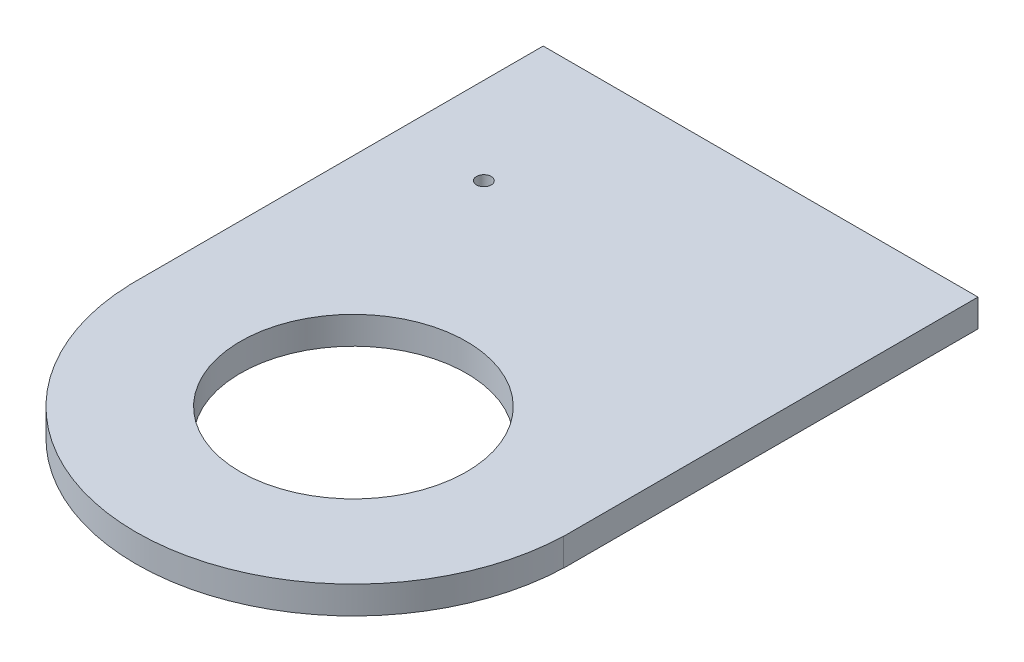
ISO-10303-21;
HEADER;
FILE_DESCRIPTION(('STEP AP214'),'2;1');
FILE_NAME('part.step','',(''),(''),'','','');
FILE_SCHEMA(('AUTOMOTIVE_DESIGN { 1 0 10303 214 1 1 1 1 }'));
ENDSEC;
DATA;
#1=APPLICATION_CONTEXT('core data for automotive mechanical design processes');
#2=APPLICATION_PROTOCOL_DEFINITION('international standard','automotive_design',2000,#1);
#3=PRODUCT_CONTEXT('',#1,'mechanical');
#4=PRODUCT('Part','Part','',(#3));
#5=PRODUCT_RELATED_PRODUCT_CATEGORY('part','',(#4));
#6=PRODUCT_DEFINITION_FORMATION('','',#4);
#7=PRODUCT_DEFINITION_CONTEXT('part definition',#1,'design');
#8=PRODUCT_DEFINITION('design','',#6,#7);
#9=PRODUCT_DEFINITION_SHAPE('','',#8);
#10=(LENGTH_UNIT() NAMED_UNIT(*) SI_UNIT(.MILLI.,.METRE.));
#11=(NAMED_UNIT(*) PLANE_ANGLE_UNIT() SI_UNIT($,.RADIAN.));
#12=(NAMED_UNIT(*) SI_UNIT($,.STERADIAN.) SOLID_ANGLE_UNIT());
#13=UNCERTAINTY_MEASURE_WITH_UNIT(LENGTH_MEASURE(1.E-05),#10,'distance_accuracy_value','');
#14=(GEOMETRIC_REPRESENTATION_CONTEXT(3) GLOBAL_UNCERTAINTY_ASSIGNED_CONTEXT((#13)) GLOBAL_UNIT_ASSIGNED_CONTEXT((#10,
#11,#12)) REPRESENTATION_CONTEXT('',''));
#15=CARTESIAN_POINT('',(0.,0.,0.));
#16=DIRECTION('',(0.,0.,1.));
#17=DIRECTION('',(1.,0.,0.));
#18=AXIS2_PLACEMENT_3D('',#15,#16,#17);
#19=CARTESIAN_POINT('',(-50.,36.1,171.65));
#20=DIRECTION('',(0.,0.,-1.));
#21=DIRECTION('',(-1.,0.,0.));
#22=AXIS2_PLACEMENT_3D('',#19,#20,#21);
#23=PLANE('',#22);
#24=DIRECTION('',(0.,-1.,0.));
#25=VECTOR('',#24,1.);
#26=CARTESIAN_POINT('',(49.9727675839552,36.1,171.65));
#27=LINE('',#26,#25);
#28=CARTESIAN_POINT('',(49.9727675839552,29.75,171.65));
#29=VERTEX_POINT('',#28);
#30=CARTESIAN_POINT('',(49.9727675839552,36.1,171.65));
#31=VERTEX_POINT('',#30);
#32=EDGE_CURVE('E116',#29,#31,#27,.F.);
#33=ORIENTED_EDGE('',*,*,#32,.F.);
#34=DIRECTION('',(1.,0.,0.));
#35=VECTOR('',#34,1.);
#36=CARTESIAN_POINT('',(-50.,29.75,171.65));
#37=LINE('',#36,#35);
#38=CARTESIAN_POINT('',(50.,29.75,171.65));
#39=VERTEX_POINT('',#38);
#40=EDGE_CURVE('E106',#29,#39,#37,.T.);
#41=ORIENTED_EDGE('',*,*,#40,.T.);
#42=DIRECTION('',(0.,-1.,0.));
#43=VECTOR('',#42,1.);
#44=CARTESIAN_POINT('',(50.,36.1,171.65));
#45=LINE('',#44,#43);
#46=CARTESIAN_POINT('',(50.,36.1,171.65));
#47=VERTEX_POINT('',#46);
#48=EDGE_CURVE('E147',#47,#39,#45,.T.);
#49=ORIENTED_EDGE('',*,*,#48,.F.);
#50=DIRECTION('',(1.,0.,0.));
#51=VECTOR('',#50,1.);
#52=CARTESIAN_POINT('',(-50.,36.1,171.65));
#53=LINE('',#52,#51);
#54=EDGE_CURVE('E56',#31,#47,#53,.T.);
#55=ORIENTED_EDGE('',*,*,#54,.F.);
#56=EDGE_LOOP('',(#33,#41,#49,#55));
#57=FACE_BOUND('',#56,.T.);
#58=ADVANCED_FACE('F43',(#57),#23,.F.);
#59=DIRECTION('',(0.,-1.,0.));
#60=VECTOR('',#59,1.);
#61=CARTESIAN_POINT('',(-49.9727675839552,36.1,171.65));
#62=LINE('',#61,#60);
#63=CARTESIAN_POINT('',(-49.9727675839552,36.1,171.65));
#64=VERTEX_POINT('',#63);
#65=CARTESIAN_POINT('',(-49.9727675839552,29.75,171.65));
#66=VERTEX_POINT('',#65);
#67=EDGE_CURVE('E70',#64,#66,#62,.T.);
#68=ORIENTED_EDGE('',*,*,#67,.F.);
#69=CARTESIAN_POINT('',(-50.,36.1,171.65));
#70=VERTEX_POINT('',#69);
#71=EDGE_CURVE('E143',#70,#64,#53,.T.);
#72=ORIENTED_EDGE('',*,*,#71,.F.);
#73=DIRECTION('',(0.,-1.,0.));
#74=VECTOR('',#73,1.);
#75=CARTESIAN_POINT('',(-50.,36.1,171.65));
#76=LINE('',#75,#74);
#77=CARTESIAN_POINT('',(-50.,29.75,171.65));
#78=VERTEX_POINT('',#77);
#79=EDGE_CURVE('E99',#70,#78,#76,.T.);
#80=ORIENTED_EDGE('',*,*,#79,.T.);
#81=EDGE_CURVE('E97',#78,#66,#37,.T.);
#82=ORIENTED_EDGE('',*,*,#81,.T.);
#83=EDGE_LOOP('',(#68,#72,#80,#82));
#84=FACE_BOUND('',#83,.T.);
#85=ADVANCED_FACE('F96',(#84),#23,.F.);
#86=CARTESIAN_POINT('',(50.,36.1,171.65));
#87=DIRECTION('',(-1.,0.,0.));
#88=DIRECTION('',(0.,0.,1.));
#89=AXIS2_PLACEMENT_3D('',#86,#87,#88);
#90=PLANE('',#89);
#91=DIRECTION('',(0.,0.,-1.));
#92=VECTOR('',#91,1.);
#93=CARTESIAN_POINT('',(50.,29.75,171.65));
#94=LINE('',#93,#92);
#95=CARTESIAN_POINT('',(50.,29.75,76.35));
#96=VERTEX_POINT('',#95);
#97=EDGE_CURVE('E137',#39,#96,#94,.T.);
#98=ORIENTED_EDGE('',*,*,#97,.T.);
#99=DIRECTION('',(0.,-1.,0.));
#100=VECTOR('',#99,1.);
#101=CARTESIAN_POINT('',(50.,36.1,76.35));
#102=LINE('',#101,#100);
#103=CARTESIAN_POINT('',(50.,36.1,76.35));
#104=VERTEX_POINT('',#103);
#105=EDGE_CURVE('E11',#104,#96,#102,.T.);
#106=ORIENTED_EDGE('',*,*,#105,.F.);
#107=DIRECTION('',(0.,0.,-1.));
#108=VECTOR('',#107,1.);
#109=CARTESIAN_POINT('',(50.,36.1,171.65));
#110=LINE('',#109,#108);
#111=EDGE_CURVE('E102',#47,#104,#110,.T.);
#112=ORIENTED_EDGE('',*,*,#111,.F.);
#113=ORIENTED_EDGE('',*,*,#48,.T.);
#114=EDGE_LOOP('',(#98,#106,#112,#113));
#115=FACE_BOUND('',#114,.T.);
#116=ADVANCED_FACE('F44',(#115),#90,.F.);
#117=CARTESIAN_POINT('',(-50.,36.1,76.35));
#118=DIRECTION('',(0.,0.,1.));
#119=DIRECTION('',(1.,0.,0.));
#120=AXIS2_PLACEMENT_3D('',#117,#118,#119);
#121=PLANE('',#120);
#122=CARTESIAN_POINT('',(-42.,32.9275,76.35));
#123=DIRECTION('',(0.,0.,-1.));
#124=DIRECTION('',(-1.,0.,0.));
#125=AXIS2_PLACEMENT_3D('',#122,#123,#124);
#126=CIRCLE('',#125,1.25);
#127=CARTESIAN_POINT('',(-43.25,32.9275,76.35));
#128=VERTEX_POINT('',#127);
#129=EDGE_CURVE('E194',#128,#128,#126,.T.);
#130=ORIENTED_EDGE('',*,*,#129,.F.);
#131=EDGE_LOOP('',(#130));
#132=FACE_BOUND('',#131,.T.);
#133=CARTESIAN_POINT('',(-20.,32.9275,76.35));
#134=DIRECTION('',(0.,0.,-1.));
#135=DIRECTION('',(-1.,0.,0.));
#136=AXIS2_PLACEMENT_3D('',#133,#134,#135);
#137=CIRCLE('',#136,1.25);
#138=CARTESIAN_POINT('',(-21.25,32.9275,76.35));
#139=VERTEX_POINT('',#138);
#140=EDGE_CURVE('E181',#139,#139,#137,.T.);
#141=ORIENTED_EDGE('',*,*,#140,.F.);
#142=EDGE_LOOP('',(#141));
#143=FACE_BOUND('',#142,.T.);
#144=CARTESIAN_POINT('',(20.,32.9275,76.35));
#145=DIRECTION('',(0.,0.,-1.));
#146=DIRECTION('',(-1.,0.,0.));
#147=AXIS2_PLACEMENT_3D('',#144,#145,#146);
#148=CIRCLE('',#147,1.25);
#149=CARTESIAN_POINT('',(18.75,32.9275,76.35));
#150=VERTEX_POINT('',#149);
#151=EDGE_CURVE('E180',#150,#150,#148,.T.);
#152=ORIENTED_EDGE('',*,*,#151,.F.);
#153=EDGE_LOOP('',(#152));
#154=FACE_BOUND('',#153,.T.);
#155=CARTESIAN_POINT('',(42.,32.9275,76.35));
#156=DIRECTION('',(0.,0.,-1.));
#157=DIRECTION('',(-1.,0.,0.));
#158=AXIS2_PLACEMENT_3D('',#155,#156,#157);
#159=CIRCLE('',#158,1.25);
#160=CARTESIAN_POINT('',(40.75,32.9275,76.35));
#161=VERTEX_POINT('',#160);
#162=EDGE_CURVE('E195',#161,#161,#159,.T.);
#163=ORIENTED_EDGE('',*,*,#162,.F.);
#164=EDGE_LOOP('',(#163));
#165=FACE_BOUND('',#164,.T.);
#166=DIRECTION('',(-1.,0.,0.));
#167=VECTOR('',#166,1.);
#168=CARTESIAN_POINT('',(-50.,29.75,76.35));
#169=LINE('',#168,#167);
#170=CARTESIAN_POINT('',(-50.,29.75,76.35));
#171=VERTEX_POINT('',#170);
#172=EDGE_CURVE('E153',#96,#171,#169,.T.);
#173=ORIENTED_EDGE('',*,*,#172,.T.);
#174=DIRECTION('',(0.,-1.,0.));
#175=VECTOR('',#174,1.);
#176=CARTESIAN_POINT('',(-50.,36.1,76.35));
#177=LINE('',#176,#175);
#178=CARTESIAN_POINT('',(-50.,36.1,76.35));
#179=VERTEX_POINT('',#178);
#180=EDGE_CURVE('E55',#179,#171,#177,.T.);
#181=ORIENTED_EDGE('',*,*,#180,.F.);
#182=DIRECTION('',(-1.,0.,0.));
#183=VECTOR('',#182,1.);
#184=CARTESIAN_POINT('',(-50.,36.1,76.35));
#185=LINE('',#184,#183);
#186=EDGE_CURVE('E139',#104,#179,#185,.T.);
#187=ORIENTED_EDGE('',*,*,#186,.F.);
#188=ORIENTED_EDGE('',*,*,#105,.T.);
#189=EDGE_LOOP('',(#173,#181,#187,#188));
#190=FACE_BOUND('',#189,.T.);
#191=ADVANCED_FACE('F171',(#132,#143,#154,#165,#190),#121,.F.);
#192=CARTESIAN_POINT('',(-50.,36.1,171.65));
#193=DIRECTION('',(1.,0.,0.));
#194=DIRECTION('',(0.,0.,-1.));
#195=AXIS2_PLACEMENT_3D('',#192,#193,#194);
#196=PLANE('',#195);
#197=DIRECTION('',(0.,0.,1.));
#198=VECTOR('',#197,1.);
#199=CARTESIAN_POINT('',(-50.,29.75,171.65));
#200=LINE('',#199,#198);
#201=EDGE_CURVE('E154',#171,#78,#200,.T.);
#202=ORIENTED_EDGE('',*,*,#201,.T.);
#203=ORIENTED_EDGE('',*,*,#79,.F.);
#204=DIRECTION('',(0.,0.,1.));
#205=VECTOR('',#204,1.);
#206=CARTESIAN_POINT('',(-50.,36.1,171.65));
#207=LINE('',#206,#205);
#208=EDGE_CURVE('E145',#179,#70,#207,.T.);
#209=ORIENTED_EDGE('',*,*,#208,.F.);
#210=ORIENTED_EDGE('',*,*,#180,.T.);
#211=EDGE_LOOP('',(#202,#203,#209,#210));
#212=FACE_BOUND('',#211,.T.);
#213=ADVANCED_FACE('F168',(#212),#196,.F.);
#214=CARTESIAN_POINT('',(0.,36.1,0.));
#215=DIRECTION('',(0.,-1.,0.));
#216=DIRECTION('',(0.,0.,-1.));
#217=AXIS2_PLACEMENT_3D('',#214,#215,#216);
#218=PLANE('',#217);
#219=CARTESIAN_POINT('',(-30.,36.1,110.));
#220=DIRECTION('',(0.,1.,0.));
#221=DIRECTION('',(0.,0.,1.));
#222=AXIS2_PLACEMENT_3D('',#219,#220,#221);
#223=CIRCLE('',#222,1.7);
#224=CARTESIAN_POINT('',(-30.,36.1,111.7));
#225=VERTEX_POINT('',#224);
#226=EDGE_CURVE('E184',#225,#225,#223,.T.);
#227=ORIENTED_EDGE('',*,*,#226,.F.);
#228=EDGE_LOOP('',(#227));
#229=FACE_BOUND('',#228,.T.);
#230=CARTESIAN_POINT('',(0.,36.1,170.));
#231=DIRECTION('',(0.,1.,0.));
#232=DIRECTION('',(0.,0.,1.));
#233=AXIS2_PLACEMENT_3D('',#230,#231,#232);
#234=CIRCLE('',#233,26.);
#235=CARTESIAN_POINT('',(0.,36.1,196.));
#236=VERTEX_POINT('',#235);
#237=EDGE_CURVE('E125',#236,#236,#234,.T.);
#238=ORIENTED_EDGE('',*,*,#237,.F.);
#239=EDGE_LOOP('',(#238));
#240=FACE_BOUND('',#239,.T.);
#241=ORIENTED_EDGE('',*,*,#71,.T.);
#242=CARTESIAN_POINT('',(0.,36.1,170.));
#243=DIRECTION('',(0.,1.,0.));
#244=DIRECTION('',(0.,0.,1.));
#245=AXIS2_PLACEMENT_3D('',#242,#243,#244);
#246=CIRCLE('',#245,50.);
#247=EDGE_CURVE('E112',#64,#31,#246,.T.);
#248=ORIENTED_EDGE('',*,*,#247,.T.);
#249=ORIENTED_EDGE('',*,*,#54,.T.);
#250=ORIENTED_EDGE('',*,*,#111,.T.);
#251=ORIENTED_EDGE('',*,*,#186,.T.);
#252=ORIENTED_EDGE('',*,*,#208,.T.);
#253=EDGE_LOOP('',(#241,#248,#249,#250,#251,#252));
#254=FACE_BOUND('',#253,.T.);
#255=ADVANCED_FACE('F225',(#229,#240,#254),#218,.F.);
#256=CARTESIAN_POINT('',(0.,29.75,0.));
#257=DIRECTION('',(0.,-1.,0.));
#258=DIRECTION('',(0.,0.,-1.));
#259=AXIS2_PLACEMENT_3D('',#256,#257,#258);
#260=PLANE('',#259);
#261=CARTESIAN_POINT('',(-30.,29.75,110.));
#262=DIRECTION('',(0.,1.,0.));
#263=DIRECTION('',(0.,0.,1.));
#264=AXIS2_PLACEMENT_3D('',#261,#262,#263);
#265=CIRCLE('',#264,1.7);
#266=CARTESIAN_POINT('',(-30.,29.75,111.7));
#267=VERTEX_POINT('',#266);
#268=EDGE_CURVE('E182',#267,#267,#265,.T.);
#269=ORIENTED_EDGE('',*,*,#268,.T.);
#270=EDGE_LOOP('',(#269));
#271=FACE_BOUND('',#270,.T.);
#272=CARTESIAN_POINT('',(0.,29.75,170.));
#273=DIRECTION('',(0.,1.,0.));
#274=DIRECTION('',(0.,0.,1.));
#275=AXIS2_PLACEMENT_3D('',#272,#273,#274);
#276=CIRCLE('',#275,26.);
#277=CARTESIAN_POINT('',(0.,29.75,196.));
#278=VERTEX_POINT('',#277);
#279=EDGE_CURVE('E129',#278,#278,#276,.T.);
#280=ORIENTED_EDGE('',*,*,#279,.T.);
#281=EDGE_LOOP('',(#280));
#282=FACE_BOUND('',#281,.T.);
#283=ORIENTED_EDGE('',*,*,#81,.F.);
#284=ORIENTED_EDGE('',*,*,#201,.F.);
#285=ORIENTED_EDGE('',*,*,#172,.F.);
#286=ORIENTED_EDGE('',*,*,#97,.F.);
#287=ORIENTED_EDGE('',*,*,#40,.F.);
#288=CARTESIAN_POINT('',(0.,29.75,170.));
#289=DIRECTION('',(0.,1.,0.));
#290=DIRECTION('',(0.,0.,1.));
#291=AXIS2_PLACEMENT_3D('',#288,#289,#290);
#292=CIRCLE('',#291,50.);
#293=EDGE_CURVE('E115',#66,#29,#292,.T.);
#294=ORIENTED_EDGE('',*,*,#293,.F.);
#295=EDGE_LOOP('',(#283,#284,#285,#286,#287,#294));
#296=FACE_BOUND('',#295,.T.);
#297=ADVANCED_FACE('F118',(#271,#282,#296),#260,.T.);
#298=CARTESIAN_POINT('',(0.,36.1,170.));
#299=DIRECTION('',(0.,-1.,0.));
#300=DIRECTION('',(0.,0.,-1.));
#301=AXIS2_PLACEMENT_3D('',#298,#299,#300);
#302=CYLINDRICAL_SURFACE('',#301,50.);
#303=ORIENTED_EDGE('',*,*,#293,.T.);
#304=ORIENTED_EDGE('',*,*,#32,.T.);
#305=ORIENTED_EDGE('',*,*,#247,.F.);
#306=ORIENTED_EDGE('',*,*,#67,.T.);
#307=EDGE_LOOP('',(#303,#304,#305,#306));
#308=FACE_BOUND('',#307,.T.);
#309=ADVANCED_FACE('F111',(#308),#302,.T.);
#310=CARTESIAN_POINT('',(0.,36.1,170.));
#311=DIRECTION('',(0.,-1.,0.));
#312=DIRECTION('',(0.,0.,-1.));
#313=AXIS2_PLACEMENT_3D('',#310,#311,#312);
#314=CYLINDRICAL_SURFACE('',#313,26.);
#315=ORIENTED_EDGE('',*,*,#237,.T.);
#316=EDGE_LOOP('',(#315));
#317=FACE_BOUND('',#316,.T.);
#318=ORIENTED_EDGE('',*,*,#279,.F.);
#319=EDGE_LOOP('',(#318));
#320=FACE_BOUND('',#319,.T.);
#321=ADVANCED_FACE('F229',(#317,#320),#314,.F.);
#322=CARTESIAN_POINT('',(-30.,36.1,110.));
#323=DIRECTION('',(0.,-1.,0.));
#324=DIRECTION('',(0.,0.,-1.));
#325=AXIS2_PLACEMENT_3D('',#322,#323,#324);
#326=CYLINDRICAL_SURFACE('',#325,1.7);
#327=ORIENTED_EDGE('',*,*,#226,.T.);
#328=EDGE_LOOP('',(#327));
#329=FACE_BOUND('',#328,.T.);
#330=ORIENTED_EDGE('',*,*,#268,.F.);
#331=EDGE_LOOP('',(#330));
#332=FACE_BOUND('',#331,.T.);
#333=ADVANCED_FACE('F219',(#329,#332),#326,.F.);
#334=CARTESIAN_POINT('',(42.,32.9275,85.35));
#335=DIRECTION('',(0.,0.,-1.));
#336=DIRECTION('',(-1.,0.,0.));
#337=AXIS2_PLACEMENT_3D('',#334,#335,#336);
#338=CYLINDRICAL_SURFACE('',#337,1.25);
#339=CARTESIAN_POINT('',(42.,32.9275,85.35));
#340=DIRECTION('',(0.,0.,-1.));
#341=DIRECTION('',(-1.,0.,0.));
#342=AXIS2_PLACEMENT_3D('',#339,#340,#341);
#343=CIRCLE('',#342,1.25);
#344=CARTESIAN_POINT('',(40.75,32.9275,85.35));
#345=VERTEX_POINT('',#344);
#346=EDGE_CURVE('E186',#345,#345,#343,.T.);
#347=ORIENTED_EDGE('',*,*,#346,.F.);
#348=EDGE_LOOP('',(#347));
#349=FACE_BOUND('',#348,.T.);
#350=ORIENTED_EDGE('',*,*,#162,.T.);
#351=EDGE_LOOP('',(#350));
#352=FACE_BOUND('',#351,.T.);
#353=ADVANCED_FACE('F258',(#349,#352),#338,.F.);
#354=CARTESIAN_POINT('',(42.,32.9275,85.35));
#355=DIRECTION('',(0.,0.,-1.));
#356=DIRECTION('',(-1.,0.,0.));
#357=AXIS2_PLACEMENT_3D('',#354,#355,#356);
#358=PLANE('',#357);
#359=ORIENTED_EDGE('',*,*,#346,.T.);
#360=EDGE_LOOP('',(#359));
#361=FACE_BOUND('',#360,.T.);
#362=ADVANCED_FACE('F263',(#361),#358,.T.);
#363=CARTESIAN_POINT('',(20.,32.9275,85.35));
#364=DIRECTION('',(0.,0.,-1.));
#365=DIRECTION('',(-1.,0.,0.));
#366=AXIS2_PLACEMENT_3D('',#363,#364,#365);
#367=CYLINDRICAL_SURFACE('',#366,1.25);
#368=CARTESIAN_POINT('',(20.,32.9275,85.35));
#369=DIRECTION('',(0.,0.,-1.));
#370=DIRECTION('',(-1.,0.,0.));
#371=AXIS2_PLACEMENT_3D('',#368,#369,#370);
#372=CIRCLE('',#371,1.25);
#373=CARTESIAN_POINT('',(18.75,32.9275,85.35));
#374=VERTEX_POINT('',#373);
#375=EDGE_CURVE('E209',#374,#374,#372,.T.);
#376=ORIENTED_EDGE('',*,*,#375,.F.);
#377=EDGE_LOOP('',(#376));
#378=FACE_BOUND('',#377,.T.);
#379=ORIENTED_EDGE('',*,*,#151,.T.);
#380=EDGE_LOOP('',(#379));
#381=FACE_BOUND('',#380,.T.);
#382=ADVANCED_FACE('F270',(#378,#381),#367,.F.);
#383=CARTESIAN_POINT('',(20.,32.9275,85.35));
#384=DIRECTION('',(0.,0.,-1.));
#385=DIRECTION('',(-1.,0.,0.));
#386=AXIS2_PLACEMENT_3D('',#383,#384,#385);
#387=PLANE('',#386);
#388=ORIENTED_EDGE('',*,*,#375,.T.);
#389=EDGE_LOOP('',(#388));
#390=FACE_BOUND('',#389,.T.);
#391=ADVANCED_FACE('F271',(#390),#387,.T.);
#392=CARTESIAN_POINT('',(-20.,32.9275,85.35));
#393=DIRECTION('',(0.,0.,-1.));
#394=DIRECTION('',(-1.,0.,0.));
#395=AXIS2_PLACEMENT_3D('',#392,#393,#394);
#396=CYLINDRICAL_SURFACE('',#395,1.25);
#397=CARTESIAN_POINT('',(-20.,32.9275,85.35));
#398=DIRECTION('',(0.,0.,-1.));
#399=DIRECTION('',(-1.,0.,0.));
#400=AXIS2_PLACEMENT_3D('',#397,#398,#399);
#401=CIRCLE('',#400,1.25);
#402=CARTESIAN_POINT('',(-21.25,32.9275,85.35));
#403=VERTEX_POINT('',#402);
#404=EDGE_CURVE('E178',#403,#403,#401,.T.);
#405=ORIENTED_EDGE('',*,*,#404,.F.);
#406=EDGE_LOOP('',(#405));
#407=FACE_BOUND('',#406,.T.);
#408=ORIENTED_EDGE('',*,*,#140,.T.);
#409=EDGE_LOOP('',(#408));
#410=FACE_BOUND('',#409,.T.);
#411=ADVANCED_FACE('F276',(#407,#410),#396,.F.);
#412=CARTESIAN_POINT('',(-20.,32.9275,85.35));
#413=DIRECTION('',(0.,0.,-1.));
#414=DIRECTION('',(-1.,0.,0.));
#415=AXIS2_PLACEMENT_3D('',#412,#413,#414);
#416=PLANE('',#415);
#417=ORIENTED_EDGE('',*,*,#404,.T.);
#418=EDGE_LOOP('',(#417));
#419=FACE_BOUND('',#418,.T.);
#420=ADVANCED_FACE('F283',(#419),#416,.T.);
#421=CARTESIAN_POINT('',(-42.,32.9275,85.35));
#422=DIRECTION('',(0.,0.,-1.));
#423=DIRECTION('',(-1.,0.,0.));
#424=AXIS2_PLACEMENT_3D('',#421,#422,#423);
#425=CYLINDRICAL_SURFACE('',#424,1.25);
#426=CARTESIAN_POINT('',(-42.,32.9275,85.35));
#427=DIRECTION('',(0.,0.,-1.));
#428=DIRECTION('',(-1.,0.,0.));
#429=AXIS2_PLACEMENT_3D('',#426,#427,#428);
#430=CIRCLE('',#429,1.25);
#431=CARTESIAN_POINT('',(-43.25,32.9275,85.35));
#432=VERTEX_POINT('',#431);
#433=EDGE_CURVE('E187',#432,#432,#430,.T.);
#434=ORIENTED_EDGE('',*,*,#433,.F.);
#435=EDGE_LOOP('',(#434));
#436=FACE_BOUND('',#435,.T.);
#437=ORIENTED_EDGE('',*,*,#129,.T.);
#438=EDGE_LOOP('',(#437));
#439=FACE_BOUND('',#438,.T.);
#440=ADVANCED_FACE('F284',(#436,#439),#425,.F.);
#441=CARTESIAN_POINT('',(-42.,32.9275,85.35));
#442=DIRECTION('',(0.,0.,-1.));
#443=DIRECTION('',(-1.,0.,0.));
#444=AXIS2_PLACEMENT_3D('',#441,#442,#443);
#445=PLANE('',#444);
#446=ORIENTED_EDGE('',*,*,#433,.T.);
#447=EDGE_LOOP('',(#446));
#448=FACE_BOUND('',#447,.T.);
#449=ADVANCED_FACE('F293',(#448),#445,.T.);
#450=CLOSED_SHELL('',(#58,#85,#116,#191,#213,#255,#297,#309,#321,#333,#353,#362,#382,#391,#411,
#420,#440,#449));
#451=MANIFOLD_SOLID_BREP('B2',#450);
#452=ADVANCED_BREP_SHAPE_REPRESENTATION('',(#18,#451),#14);
#453=SHAPE_DEFINITION_REPRESENTATION(#9,#452);
ENDSEC;
END-ISO-10303-21;
